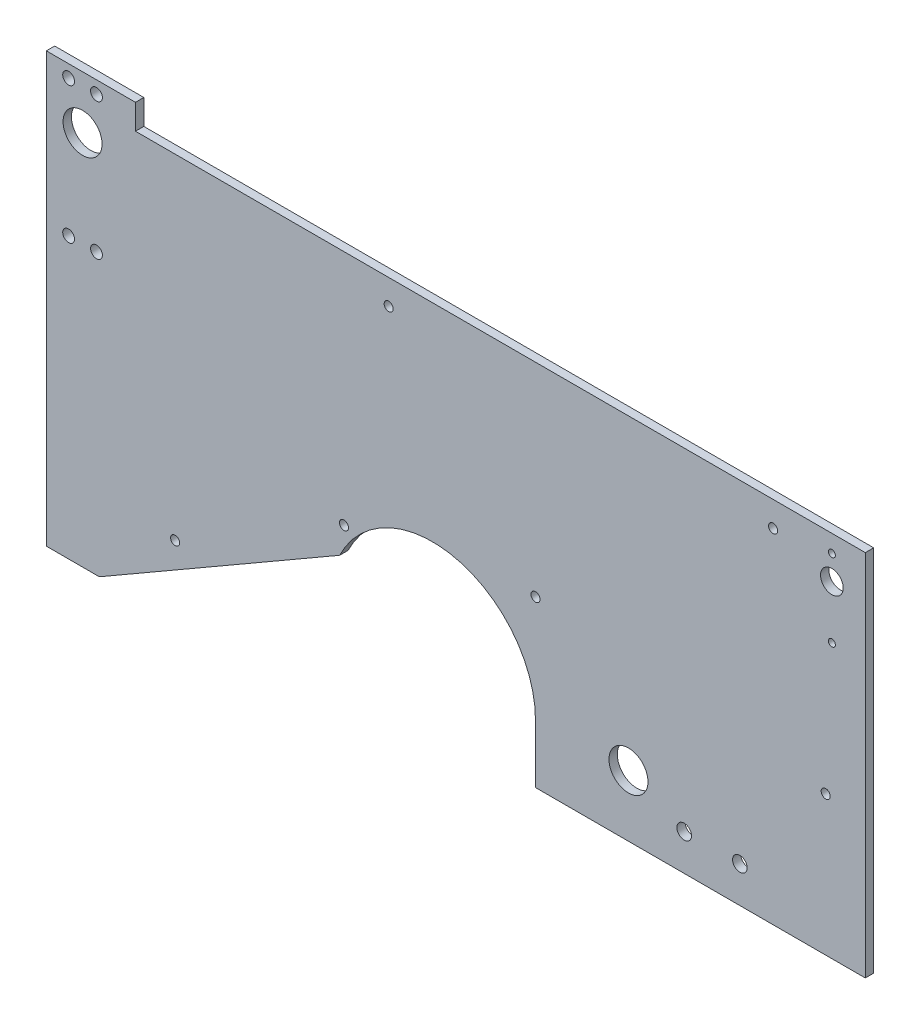
ISO-10303-21;
HEADER;
FILE_DESCRIPTION(('STEP AP214'),'2;1');
FILE_NAME('part.step','',(''),(''),'','','');
FILE_SCHEMA(('AUTOMOTIVE_DESIGN { 1 0 10303 214 1 1 1 1 }'));
ENDSEC;
DATA;
#1=APPLICATION_CONTEXT('core data for automotive mechanical design processes');
#2=APPLICATION_PROTOCOL_DEFINITION('international standard','automotive_design',2000,#1);
#3=PRODUCT_CONTEXT('',#1,'mechanical');
#4=PRODUCT('Part','Part','',(#3));
#5=PRODUCT_RELATED_PRODUCT_CATEGORY('part','',(#4));
#6=PRODUCT_DEFINITION_FORMATION('','',#4);
#7=PRODUCT_DEFINITION_CONTEXT('part definition',#1,'design');
#8=PRODUCT_DEFINITION('design','',#6,#7);
#9=PRODUCT_DEFINITION_SHAPE('','',#8);
#10=(LENGTH_UNIT() NAMED_UNIT(*) SI_UNIT(.MILLI.,.METRE.));
#11=(NAMED_UNIT(*) PLANE_ANGLE_UNIT() SI_UNIT($,.RADIAN.));
#12=(NAMED_UNIT(*) SI_UNIT($,.STERADIAN.) SOLID_ANGLE_UNIT());
#13=UNCERTAINTY_MEASURE_WITH_UNIT(LENGTH_MEASURE(1.E-05),#10,'distance_accuracy_value','');
#14=(GEOMETRIC_REPRESENTATION_CONTEXT(3) GLOBAL_UNCERTAINTY_ASSIGNED_CONTEXT((#13)) GLOBAL_UNIT_ASSIGNED_CONTEXT((#10,
#11,#12)) REPRESENTATION_CONTEXT('',''));
#15=CARTESIAN_POINT('',(0.,0.,0.));
#16=DIRECTION('',(0.,0.,1.));
#17=DIRECTION('',(1.,0.,0.));
#18=AXIS2_PLACEMENT_3D('',#15,#16,#17);
#19=CARTESIAN_POINT('',(144.6,33.7,3.));
#20=DIRECTION('',(0.,0.,1.));
#21=DIRECTION('',(1.,0.,0.));
#22=AXIS2_PLACEMENT_3D('',#19,#20,#21);
#23=PLANE('',#22);
#24=CARTESIAN_POINT('',(112.84,59.93,3.));
#25=DIRECTION('',(0.,0.,1.));
#26=DIRECTION('',(1.,0.,0.));
#27=AXIS2_PLACEMENT_3D('',#24,#25,#26);
#28=CIRCLE('',#27,1.625);
#29=CARTESIAN_POINT('',(114.465,59.93,3.));
#30=VERTEX_POINT('',#29);
#31=EDGE_CURVE('E218',#30,#30,#28,.T.);
#32=ORIENTED_EDGE('',*,*,#31,.F.);
#33=EDGE_LOOP('',(#32));
#34=FACE_BOUND('',#33,.T.);
#35=CARTESIAN_POINT('',(52.23,24.91,3.));
#36=DIRECTION('',(0.,0.,1.));
#37=DIRECTION('',(1.,0.,0.));
#38=AXIS2_PLACEMENT_3D('',#35,#36,#37);
#39=CIRCLE('',#38,1.625);
#40=CARTESIAN_POINT('',(53.855,24.91,3.));
#41=VERTEX_POINT('',#40);
#42=EDGE_CURVE('E240',#41,#41,#39,.T.);
#43=ORIENTED_EDGE('',*,*,#42,.F.);
#44=EDGE_LOOP('',(#43));
#45=FACE_BOUND('',#44,.T.);
#46=CARTESIAN_POINT('',(181.6,72.03,3.));
#47=DIRECTION('',(0.,0.,1.));
#48=DIRECTION('',(1.,0.,0.));
#49=AXIS2_PLACEMENT_3D('',#46,#47,#48);
#50=CIRCLE('',#49,1.62499999999998);
#51=CARTESIAN_POINT('',(183.225,72.03,3.));
#52=VERTEX_POINT('',#51);
#53=EDGE_CURVE('E234',#52,#52,#50,.T.);
#54=ORIENTED_EDGE('',*,*,#53,.F.);
#55=EDGE_LOOP('',(#54));
#56=FACE_BOUND('',#55,.T.);
#57=CARTESIAN_POINT('',(285.78,62.92,3.));
#58=DIRECTION('',(0.,0.,1.));
#59=DIRECTION('',(1.,0.,0.));
#60=AXIS2_PLACEMENT_3D('',#57,#58,#59);
#61=CIRCLE('',#60,1.62499999999998);
#62=CARTESIAN_POINT('',(287.405,62.92,3.));
#63=VERTEX_POINT('',#62);
#64=EDGE_CURVE('E228',#63,#63,#61,.T.);
#65=ORIENTED_EDGE('',*,*,#64,.F.);
#66=EDGE_LOOP('',(#65));
#67=FACE_BOUND('',#66,.T.);
#68=CARTESIAN_POINT('',(234.98,25.75,3.));
#69=DIRECTION('',(0.,0.,1.));
#70=DIRECTION('',(1.,0.,0.));
#71=AXIS2_PLACEMENT_3D('',#68,#69,#70);
#72=CIRCLE('',#71,2.625);
#73=CARTESIAN_POINT('',(237.605,25.75,3.));
#74=VERTEX_POINT('',#73);
#75=EDGE_CURVE('E264',#74,#74,#72,.T.);
#76=ORIENTED_EDGE('',*,*,#75,.F.);
#77=EDGE_LOOP('',(#76));
#78=FACE_BOUND('',#77,.T.);
#79=CARTESIAN_POINT('',(288.,130.,3.));
#80=DIRECTION('',(0.,0.,1.));
#81=DIRECTION('',(1.,0.,0.));
#82=AXIS2_PLACEMENT_3D('',#79,#80,#81);
#83=CIRCLE('',#82,4.07499999999998);
#84=CARTESIAN_POINT('',(292.075,130.,3.));
#85=VERTEX_POINT('',#84);
#86=EDGE_CURVE('E251',#85,#85,#83,.T.);
#87=ORIENTED_EDGE('',*,*,#86,.F.);
#88=EDGE_LOOP('',(#87));
#89=FACE_BOUND('',#88,.T.);
#90=CARTESIAN_POINT('',(288.,138.75,3.));
#91=DIRECTION('',(0.,0.,1.));
#92=DIRECTION('',(1.,0.,0.));
#93=AXIS2_PLACEMENT_3D('',#90,#91,#92);
#94=CIRCLE('',#93,1.24999999999996);
#95=CARTESIAN_POINT('',(289.25,138.75,3.));
#96=VERTEX_POINT('',#95);
#97=EDGE_CURVE('E252',#96,#96,#94,.T.);
#98=ORIENTED_EDGE('',*,*,#97,.F.);
#99=EDGE_LOOP('',(#98));
#100=FACE_BOUND('',#99,.T.);
#101=CARTESIAN_POINT('',(288.,110.95,3.));
#102=DIRECTION('',(0.,0.,1.));
#103=DIRECTION('',(1.,0.,0.));
#104=AXIS2_PLACEMENT_3D('',#101,#102,#103);
#105=CIRCLE('',#104,1.24999999999995);
#106=CARTESIAN_POINT('',(289.25,110.95,3.));
#107=VERTEX_POINT('',#106);
#108=EDGE_CURVE('E227',#107,#107,#105,.T.);
#109=ORIENTED_EDGE('',*,*,#108,.F.);
#110=EDGE_LOOP('',(#109));
#111=FACE_BOUND('',#110,.T.);
#112=CARTESIAN_POINT('',(214.98,34.75,3.));
#113=DIRECTION('',(0.,0.,1.));
#114=DIRECTION('',(1.,0.,0.));
#115=AXIS2_PLACEMENT_3D('',#112,#113,#114);
#116=CIRCLE('',#115,7.00000000000001);
#117=CARTESIAN_POINT('',(221.98,34.75,3.));
#118=VERTEX_POINT('',#117);
#119=EDGE_CURVE('E212',#118,#118,#116,.T.);
#120=ORIENTED_EDGE('',*,*,#119,.F.);
#121=EDGE_LOOP('',(#120));
#122=FACE_BOUND('',#121,.T.);
#123=DIRECTION('',(0.,1.,0.));
#124=VECTOR('',#123,1.);
#125=CARTESIAN_POINT('',(6.,154.,3.));
#126=LINE('',#125,#124);
#127=CARTESIAN_POINT('',(6.00000000000002,0.,3.));
#128=VERTEX_POINT('',#127);
#129=CARTESIAN_POINT('',(6.00000000000002,154.,3.));
#130=VERTEX_POINT('',#129);
#131=EDGE_CURVE('E51',#128,#130,#126,.T.);
#132=ORIENTED_EDGE('',*,*,#131,.F.);
#133=DIRECTION('',(1.,0.,0.));
#134=VECTOR('',#133,1.);
#135=CARTESIAN_POINT('',(0.,0.,3.));
#136=LINE('',#135,#134);
#137=CARTESIAN_POINT('',(25.030359010412,0.,3.));
#138=VERTEX_POINT('',#137);
#139=EDGE_CURVE('E124',#128,#138,#136,.T.);
#140=ORIENTED_EDGE('',*,*,#139,.T.);
#141=DIRECTION('',(0.866025403784438,0.500000000000001,0.));
#142=VECTOR('',#141,1.);
#143=CARTESIAN_POINT('',(25.030359010412,0.,3.));
#144=LINE('',#143,#142);
#145=CARTESIAN_POINT('',(111.286489227342,49.8000000000001,3.));
#146=VERTEX_POINT('',#145);
#147=EDGE_CURVE('E190',#138,#146,#144,.T.);
#148=ORIENTED_EDGE('',*,*,#147,.T.);
#149=CARTESIAN_POINT('',(144.6,33.7,3.));
#150=DIRECTION('',(0.,0.,-1.));
#151=DIRECTION('',(1.,0.,0.));
#152=AXIS2_PLACEMENT_3D('',#149,#150,#151);
#153=CIRCLE('',#152,37.);
#154=CARTESIAN_POINT('',(181.6,33.7,3.));
#155=VERTEX_POINT('',#154);
#156=EDGE_CURVE('E172',#146,#155,#153,.T.);
#157=ORIENTED_EDGE('',*,*,#156,.T.);
#158=DIRECTION('',(0.,-1.,0.));
#159=VECTOR('',#158,1.);
#160=CARTESIAN_POINT('',(181.6,33.7,3.));
#161=LINE('',#160,#159);
#162=CARTESIAN_POINT('',(181.6,12.75,3.));
#163=VERTEX_POINT('',#162);
#164=EDGE_CURVE('E183',#155,#163,#161,.T.);
#165=ORIENTED_EDGE('',*,*,#164,.T.);
#166=DIRECTION('',(-1.,0.,0.));
#167=VECTOR('',#166,1.);
#168=CARTESIAN_POINT('',(181.6,12.75,3.));
#169=LINE('',#168,#167);
#170=CARTESIAN_POINT('',(300.,12.75,3.));
#171=VERTEX_POINT('',#170);
#172=EDGE_CURVE('E275',#171,#163,#169,.T.);
#173=ORIENTED_EDGE('',*,*,#172,.F.);
#174=DIRECTION('',(0.,1.,0.));
#175=VECTOR('',#174,1.);
#176=CARTESIAN_POINT('',(300.,0.,3.));
#177=LINE('',#176,#175);
#178=CARTESIAN_POINT('',(300.,145.,3.));
#179=VERTEX_POINT('',#178);
#180=EDGE_CURVE('E186',#171,#179,#177,.T.);
#181=ORIENTED_EDGE('',*,*,#180,.T.);
#182=DIRECTION('',(-1.,0.,0.));
#183=VECTOR('',#182,1.);
#184=CARTESIAN_POINT('',(38.,145.,3.));
#185=LINE('',#184,#183);
#186=CARTESIAN_POINT('',(38.,145.,3.));
#187=VERTEX_POINT('',#186);
#188=EDGE_CURVE('E188',#179,#187,#185,.T.);
#189=ORIENTED_EDGE('',*,*,#188,.T.);
#190=DIRECTION('',(0.,1.,0.));
#191=VECTOR('',#190,1.);
#192=CARTESIAN_POINT('',(38.,154.,3.));
#193=LINE('',#192,#191);
#194=CARTESIAN_POINT('',(38.,154.,3.));
#195=VERTEX_POINT('',#194);
#196=EDGE_CURVE('E194',#187,#195,#193,.T.);
#197=ORIENTED_EDGE('',*,*,#196,.T.);
#198=DIRECTION('',(-1.,0.,0.));
#199=VECTOR('',#198,1.);
#200=CARTESIAN_POINT('',(19.,154.,3.));
#201=LINE('',#200,#199);
#202=EDGE_CURVE('E139',#195,#130,#201,.T.);
#203=ORIENTED_EDGE('',*,*,#202,.T.);
#204=EDGE_LOOP('',(#132,#140,#148,#157,#165,#173,#181,#189,#197,#203));
#205=FACE_BOUND('',#204,.T.);
#206=CARTESIAN_POINT('',(128.895,135.995,3.));
#207=DIRECTION('',(0.,0.,1.));
#208=DIRECTION('',(1.,0.,0.));
#209=AXIS2_PLACEMENT_3D('',#206,#207,#208);
#210=CIRCLE('',#209,1.62499999999998);
#211=CARTESIAN_POINT('',(130.52,135.995,3.));
#212=VERTEX_POINT('',#211);
#213=EDGE_CURVE('E202',#212,#212,#210,.T.);
#214=ORIENTED_EDGE('',*,*,#213,.F.);
#215=EDGE_LOOP('',(#214));
#216=FACE_BOUND('',#215,.T.);
#217=CARTESIAN_POINT('',(266.895,135.995,3.));
#218=DIRECTION('',(0.,0.,1.));
#219=DIRECTION('',(1.,0.,0.));
#220=AXIS2_PLACEMENT_3D('',#217,#218,#219);
#221=CIRCLE('',#220,1.62499999999998);
#222=CARTESIAN_POINT('',(268.52,135.995,3.));
#223=VERTEX_POINT('',#222);
#224=EDGE_CURVE('E219',#223,#223,#221,.T.);
#225=ORIENTED_EDGE('',*,*,#224,.F.);
#226=EDGE_LOOP('',(#225));
#227=FACE_BOUND('',#226,.T.);
#228=CARTESIAN_POINT('',(254.98,25.75,3.));
#229=DIRECTION('',(0.,0.,1.));
#230=DIRECTION('',(1.,0.,0.));
#231=AXIS2_PLACEMENT_3D('',#228,#229,#230);
#232=CIRCLE('',#231,2.62499999999997);
#233=CARTESIAN_POINT('',(257.605,25.75,3.));
#234=VERTEX_POINT('',#233);
#235=EDGE_CURVE('E263',#234,#234,#232,.T.);
#236=ORIENTED_EDGE('',*,*,#235,.F.);
#237=EDGE_LOOP('',(#236));
#238=FACE_BOUND('',#237,.T.);
#239=CARTESIAN_POINT('',(24.,149.5,3.));
#240=DIRECTION('',(0.,0.,1.));
#241=DIRECTION('',(-1.,0.,0.));
#242=AXIS2_PLACEMENT_3D('',#239,#240,#241);
#243=CIRCLE('',#242,2.125);
#244=CARTESIAN_POINT('',(21.875,149.5,3.));
#245=VERTEX_POINT('',#244);
#246=EDGE_CURVE('E290',#245,#245,#243,.T.);
#247=ORIENTED_EDGE('',*,*,#246,.F.);
#248=EDGE_LOOP('',(#247));
#249=FACE_BOUND('',#248,.T.);
#250=CARTESIAN_POINT('',(24.,100.5,3.));
#251=DIRECTION('',(0.,0.,1.));
#252=DIRECTION('',(1.,0.,0.));
#253=AXIS2_PLACEMENT_3D('',#250,#251,#252);
#254=CIRCLE('',#253,2.125);
#255=CARTESIAN_POINT('',(26.125,100.5,3.));
#256=VERTEX_POINT('',#255);
#257=EDGE_CURVE('E302',#256,#256,#254,.T.);
#258=ORIENTED_EDGE('',*,*,#257,.F.);
#259=EDGE_LOOP('',(#258));
#260=FACE_BOUND('',#259,.T.);
#261=CARTESIAN_POINT('',(19.,135.,3.));
#262=DIRECTION('',(0.,0.,1.));
#263=DIRECTION('',(1.,0.,0.));
#264=AXIS2_PLACEMENT_3D('',#261,#262,#263);
#265=CIRCLE('',#264,7.);
#266=CARTESIAN_POINT('',(26.,135.,3.));
#267=VERTEX_POINT('',#266);
#268=EDGE_CURVE('E131',#267,#267,#265,.T.);
#269=ORIENTED_EDGE('',*,*,#268,.F.);
#270=EDGE_LOOP('',(#269));
#271=FACE_BOUND('',#270,.T.);
#272=CARTESIAN_POINT('',(14.,149.5,3.));
#273=DIRECTION('',(0.,0.,1.));
#274=DIRECTION('',(1.,0.,0.));
#275=AXIS2_PLACEMENT_3D('',#272,#273,#274);
#276=CIRCLE('',#275,2.125);
#277=CARTESIAN_POINT('',(16.125,149.5,3.));
#278=VERTEX_POINT('',#277);
#279=EDGE_CURVE('E296',#278,#278,#276,.T.);
#280=ORIENTED_EDGE('',*,*,#279,.F.);
#281=EDGE_LOOP('',(#280));
#282=FACE_BOUND('',#281,.T.);
#283=CARTESIAN_POINT('',(14.,100.5,3.));
#284=DIRECTION('',(0.,0.,1.));
#285=DIRECTION('',(1.,0.,0.));
#286=AXIS2_PLACEMENT_3D('',#283,#284,#285);
#287=CIRCLE('',#286,2.125);
#288=CARTESIAN_POINT('',(16.125,100.5,3.));
#289=VERTEX_POINT('',#288);
#290=EDGE_CURVE('E284',#289,#289,#287,.T.);
#291=ORIENTED_EDGE('',*,*,#290,.F.);
#292=EDGE_LOOP('',(#291));
#293=FACE_BOUND('',#292,.T.);
#294=ADVANCED_FACE('F36',(#34,#45,#56,#67,#78,#89,#100,#111,#122,#205,#216,#227,#238,#249,#260,
#271,#282,#293),#23,.T.);
#295=CARTESIAN_POINT('',(144.6,33.7,0.));
#296=DIRECTION('',(0.,0.,1.));
#297=DIRECTION('',(1.,0.,0.));
#298=AXIS2_PLACEMENT_3D('',#295,#296,#297);
#299=PLANE('',#298);
#300=CARTESIAN_POINT('',(112.84,59.93,0.));
#301=DIRECTION('',(0.,0.,1.));
#302=DIRECTION('',(1.,0.,0.));
#303=AXIS2_PLACEMENT_3D('',#300,#301,#302);
#304=CIRCLE('',#303,1.625);
#305=CARTESIAN_POINT('',(114.465,59.93,0.));
#306=VERTEX_POINT('',#305);
#307=EDGE_CURVE('E243',#306,#306,#304,.T.);
#308=ORIENTED_EDGE('',*,*,#307,.T.);
#309=EDGE_LOOP('',(#308));
#310=FACE_BOUND('',#309,.T.);
#311=CARTESIAN_POINT('',(52.23,24.91,0.));
#312=DIRECTION('',(0.,0.,1.));
#313=DIRECTION('',(1.,0.,0.));
#314=AXIS2_PLACEMENT_3D('',#311,#312,#313);
#315=CIRCLE('',#314,1.625);
#316=CARTESIAN_POINT('',(53.855,24.91,0.));
#317=VERTEX_POINT('',#316);
#318=EDGE_CURVE('E237',#317,#317,#315,.T.);
#319=ORIENTED_EDGE('',*,*,#318,.T.);
#320=EDGE_LOOP('',(#319));
#321=FACE_BOUND('',#320,.T.);
#322=CARTESIAN_POINT('',(181.6,72.03,0.));
#323=DIRECTION('',(0.,0.,1.));
#324=DIRECTION('',(1.,0.,0.));
#325=AXIS2_PLACEMENT_3D('',#322,#323,#324);
#326=CIRCLE('',#325,1.62499999999998);
#327=CARTESIAN_POINT('',(183.225,72.03,0.));
#328=VERTEX_POINT('',#327);
#329=EDGE_CURVE('E231',#328,#328,#326,.T.);
#330=ORIENTED_EDGE('',*,*,#329,.T.);
#331=EDGE_LOOP('',(#330));
#332=FACE_BOUND('',#331,.T.);
#333=CARTESIAN_POINT('',(285.78,62.92,0.));
#334=DIRECTION('',(0.,0.,1.));
#335=DIRECTION('',(1.,0.,0.));
#336=AXIS2_PLACEMENT_3D('',#333,#334,#335);
#337=CIRCLE('',#336,1.62499999999998);
#338=CARTESIAN_POINT('',(287.405,62.92,0.));
#339=VERTEX_POINT('',#338);
#340=EDGE_CURVE('E224',#339,#339,#337,.T.);
#341=ORIENTED_EDGE('',*,*,#340,.T.);
#342=EDGE_LOOP('',(#341));
#343=FACE_BOUND('',#342,.T.);
#344=CARTESIAN_POINT('',(234.98,25.75,0.));
#345=DIRECTION('',(0.,0.,1.));
#346=DIRECTION('',(1.,0.,0.));
#347=AXIS2_PLACEMENT_3D('',#344,#345,#346);
#348=CIRCLE('',#347,2.625);
#349=CARTESIAN_POINT('',(237.605,25.75,0.));
#350=VERTEX_POINT('',#349);
#351=EDGE_CURVE('E260',#350,#350,#348,.T.);
#352=ORIENTED_EDGE('',*,*,#351,.T.);
#353=EDGE_LOOP('',(#352));
#354=FACE_BOUND('',#353,.T.);
#355=CARTESIAN_POINT('',(288.,130.,0.));
#356=DIRECTION('',(0.,0.,1.));
#357=DIRECTION('',(1.,0.,0.));
#358=AXIS2_PLACEMENT_3D('',#355,#356,#357);
#359=CIRCLE('',#358,4.07499999999998);
#360=CARTESIAN_POINT('',(292.075,130.,0.));
#361=VERTEX_POINT('',#360);
#362=EDGE_CURVE('E267',#361,#361,#359,.T.);
#363=ORIENTED_EDGE('',*,*,#362,.T.);
#364=EDGE_LOOP('',(#363));
#365=FACE_BOUND('',#364,.T.);
#366=CARTESIAN_POINT('',(288.,138.75,0.));
#367=DIRECTION('',(0.,0.,1.));
#368=DIRECTION('',(1.,0.,0.));
#369=AXIS2_PLACEMENT_3D('',#366,#367,#368);
#370=CIRCLE('',#369,1.24999999999996);
#371=CARTESIAN_POINT('',(289.25,138.75,0.));
#372=VERTEX_POINT('',#371);
#373=EDGE_CURVE('E248',#372,#372,#370,.T.);
#374=ORIENTED_EDGE('',*,*,#373,.T.);
#375=EDGE_LOOP('',(#374));
#376=FACE_BOUND('',#375,.T.);
#377=CARTESIAN_POINT('',(288.,110.95,0.));
#378=DIRECTION('',(0.,0.,1.));
#379=DIRECTION('',(1.,0.,0.));
#380=AXIS2_PLACEMENT_3D('',#377,#378,#379);
#381=CIRCLE('',#380,1.24999999999995);
#382=CARTESIAN_POINT('',(289.25,110.95,0.));
#383=VERTEX_POINT('',#382);
#384=EDGE_CURVE('E255',#383,#383,#381,.T.);
#385=ORIENTED_EDGE('',*,*,#384,.T.);
#386=EDGE_LOOP('',(#385));
#387=FACE_BOUND('',#386,.T.);
#388=CARTESIAN_POINT('',(214.98,34.75,0.));
#389=DIRECTION('',(0.,0.,1.));
#390=DIRECTION('',(1.,0.,0.));
#391=AXIS2_PLACEMENT_3D('',#388,#389,#390);
#392=CIRCLE('',#391,7.00000000000001);
#393=CARTESIAN_POINT('',(221.98,34.75,0.));
#394=VERTEX_POINT('',#393);
#395=EDGE_CURVE('E209',#394,#394,#392,.T.);
#396=ORIENTED_EDGE('',*,*,#395,.T.);
#397=EDGE_LOOP('',(#396));
#398=FACE_BOUND('',#397,.T.);
#399=CARTESIAN_POINT('',(128.895,135.995,0.));
#400=DIRECTION('',(0.,0.,1.));
#401=DIRECTION('',(1.,0.,0.));
#402=AXIS2_PLACEMENT_3D('',#399,#400,#401);
#403=CIRCLE('',#402,1.62499999999998);
#404=CARTESIAN_POINT('',(130.52,135.995,0.));
#405=VERTEX_POINT('',#404);
#406=EDGE_CURVE('E205',#405,#405,#403,.T.);
#407=ORIENTED_EDGE('',*,*,#406,.T.);
#408=EDGE_LOOP('',(#407));
#409=FACE_BOUND('',#408,.T.);
#410=CARTESIAN_POINT('',(266.895,135.995,0.));
#411=DIRECTION('',(0.,0.,1.));
#412=DIRECTION('',(1.,0.,0.));
#413=AXIS2_PLACEMENT_3D('',#410,#411,#412);
#414=CIRCLE('',#413,1.62499999999998);
#415=CARTESIAN_POINT('',(268.52,135.995,0.));
#416=VERTEX_POINT('',#415);
#417=EDGE_CURVE('E215',#416,#416,#414,.T.);
#418=ORIENTED_EDGE('',*,*,#417,.T.);
#419=EDGE_LOOP('',(#418));
#420=FACE_BOUND('',#419,.T.);
#421=CARTESIAN_POINT('',(254.98,25.75,0.));
#422=DIRECTION('',(0.,0.,1.));
#423=DIRECTION('',(1.,0.,0.));
#424=AXIS2_PLACEMENT_3D('',#421,#422,#423);
#425=CIRCLE('',#424,2.62499999999997);
#426=CARTESIAN_POINT('',(257.605,25.75,0.));
#427=VERTEX_POINT('',#426);
#428=EDGE_CURVE('E272',#427,#427,#425,.T.);
#429=ORIENTED_EDGE('',*,*,#428,.T.);
#430=EDGE_LOOP('',(#429));
#431=FACE_BOUND('',#430,.T.);
#432=DIRECTION('',(1.,0.,0.));
#433=VECTOR('',#432,1.);
#434=CARTESIAN_POINT('',(0.,0.,0.));
#435=LINE('',#434,#433);
#436=CARTESIAN_POINT('',(6.00000000000002,0.,0.));
#437=VERTEX_POINT('',#436);
#438=CARTESIAN_POINT('',(25.030359010412,0.,0.));
#439=VERTEX_POINT('',#438);
#440=EDGE_CURVE('E123',#437,#439,#435,.T.);
#441=ORIENTED_EDGE('',*,*,#440,.F.);
#442=DIRECTION('',(0.,1.,0.));
#443=VECTOR('',#442,1.);
#444=CARTESIAN_POINT('',(6.,154.,0.));
#445=LINE('',#444,#443);
#446=CARTESIAN_POINT('',(6.,154.,0.));
#447=VERTEX_POINT('',#446);
#448=EDGE_CURVE('E111',#437,#447,#445,.T.);
#449=ORIENTED_EDGE('',*,*,#448,.T.);
#450=DIRECTION('',(-1.,0.,0.));
#451=VECTOR('',#450,1.);
#452=CARTESIAN_POINT('',(0.,154.,0.));
#453=LINE('',#452,#451);
#454=CARTESIAN_POINT('',(38.,154.,0.));
#455=VERTEX_POINT('',#454);
#456=EDGE_CURVE('E153',#455,#447,#453,.T.);
#457=ORIENTED_EDGE('',*,*,#456,.F.);
#458=DIRECTION('',(0.,1.,0.));
#459=VECTOR('',#458,1.);
#460=CARTESIAN_POINT('',(38.,154.,0.));
#461=LINE('',#460,#459);
#462=CARTESIAN_POINT('',(38.,145.,0.));
#463=VERTEX_POINT('',#462);
#464=EDGE_CURVE('E150',#463,#455,#461,.T.);
#465=ORIENTED_EDGE('',*,*,#464,.F.);
#466=DIRECTION('',(-1.,0.,0.));
#467=VECTOR('',#466,1.);
#468=CARTESIAN_POINT('',(38.,145.,0.));
#469=LINE('',#468,#467);
#470=CARTESIAN_POINT('',(300.,145.,0.));
#471=VERTEX_POINT('',#470);
#472=EDGE_CURVE('E148',#471,#463,#469,.T.);
#473=ORIENTED_EDGE('',*,*,#472,.F.);
#474=DIRECTION('',(0.,1.,0.));
#475=VECTOR('',#474,1.);
#476=CARTESIAN_POINT('',(300.,0.,0.));
#477=LINE('',#476,#475);
#478=CARTESIAN_POINT('',(300.,12.75,0.));
#479=VERTEX_POINT('',#478);
#480=EDGE_CURVE('E146',#479,#471,#477,.T.);
#481=ORIENTED_EDGE('',*,*,#480,.F.);
#482=DIRECTION('',(-1.,0.,0.));
#483=VECTOR('',#482,1.);
#484=CARTESIAN_POINT('',(181.6,12.75,0.));
#485=LINE('',#484,#483);
#486=CARTESIAN_POINT('',(181.6,12.75,0.));
#487=VERTEX_POINT('',#486);
#488=EDGE_CURVE('E59',#479,#487,#485,.T.);
#489=ORIENTED_EDGE('',*,*,#488,.T.);
#490=DIRECTION('',(0.,-1.,0.));
#491=VECTOR('',#490,1.);
#492=CARTESIAN_POINT('',(181.6,33.7,0.));
#493=LINE('',#492,#491);
#494=CARTESIAN_POINT('',(181.6,33.7,0.));
#495=VERTEX_POINT('',#494);
#496=EDGE_CURVE('E143',#495,#487,#493,.T.);
#497=ORIENTED_EDGE('',*,*,#496,.F.);
#498=CARTESIAN_POINT('',(144.6,33.7,0.));
#499=DIRECTION('',(0.,0.,-1.));
#500=DIRECTION('',(1.,0.,0.));
#501=AXIS2_PLACEMENT_3D('',#498,#499,#500);
#502=CIRCLE('',#501,37.);
#503=CARTESIAN_POINT('',(111.286489227342,49.8000000000001,0.));
#504=VERTEX_POINT('',#503);
#505=EDGE_CURVE('E133',#504,#495,#502,.T.);
#506=ORIENTED_EDGE('',*,*,#505,.F.);
#507=DIRECTION('',(0.866025403784438,0.500000000000001,0.));
#508=VECTOR('',#507,1.);
#509=CARTESIAN_POINT('',(25.030359010412,0.,0.));
#510=LINE('',#509,#508);
#511=EDGE_CURVE('E130',#439,#504,#510,.T.);
#512=ORIENTED_EDGE('',*,*,#511,.F.);
#513=EDGE_LOOP('',(#441,#449,#457,#465,#473,#481,#489,#497,#506,#512));
#514=FACE_BOUND('',#513,.T.);
#515=CARTESIAN_POINT('',(19.,135.,0.));
#516=DIRECTION('',(0.,0.,1.));
#517=DIRECTION('',(1.,0.,0.));
#518=AXIS2_PLACEMENT_3D('',#515,#516,#517);
#519=CIRCLE('',#518,7.);
#520=CARTESIAN_POINT('',(26.,135.,0.));
#521=VERTEX_POINT('',#520);
#522=EDGE_CURVE('E136',#521,#521,#519,.T.);
#523=ORIENTED_EDGE('',*,*,#522,.T.);
#524=EDGE_LOOP('',(#523));
#525=FACE_BOUND('',#524,.T.);
#526=CARTESIAN_POINT('',(24.,100.5,0.));
#527=DIRECTION('',(0.,0.,1.));
#528=DIRECTION('',(1.,0.,0.));
#529=AXIS2_PLACEMENT_3D('',#526,#527,#528);
#530=CIRCLE('',#529,2.125);
#531=CARTESIAN_POINT('',(26.125,100.5,0.));
#532=VERTEX_POINT('',#531);
#533=EDGE_CURVE('E299',#532,#532,#530,.T.);
#534=ORIENTED_EDGE('',*,*,#533,.T.);
#535=EDGE_LOOP('',(#534));
#536=FACE_BOUND('',#535,.T.);
#537=CARTESIAN_POINT('',(14.,149.5,0.));
#538=DIRECTION('',(0.,0.,1.));
#539=DIRECTION('',(1.,0.,0.));
#540=AXIS2_PLACEMENT_3D('',#537,#538,#539);
#541=CIRCLE('',#540,2.125);
#542=CARTESIAN_POINT('',(16.125,149.5,0.));
#543=VERTEX_POINT('',#542);
#544=EDGE_CURVE('E293',#543,#543,#541,.T.);
#545=ORIENTED_EDGE('',*,*,#544,.T.);
#546=EDGE_LOOP('',(#545));
#547=FACE_BOUND('',#546,.T.);
#548=CARTESIAN_POINT('',(24.,149.5,0.));
#549=DIRECTION('',(0.,0.,1.));
#550=DIRECTION('',(-1.,0.,0.));
#551=AXIS2_PLACEMENT_3D('',#548,#549,#550);
#552=CIRCLE('',#551,2.125);
#553=CARTESIAN_POINT('',(21.875,149.5,0.));
#554=VERTEX_POINT('',#553);
#555=EDGE_CURVE('E287',#554,#554,#552,.T.);
#556=ORIENTED_EDGE('',*,*,#555,.T.);
#557=EDGE_LOOP('',(#556));
#558=FACE_BOUND('',#557,.T.);
#559=CARTESIAN_POINT('',(14.,100.5,0.));
#560=DIRECTION('',(0.,0.,1.));
#561=DIRECTION('',(1.,0.,0.));
#562=AXIS2_PLACEMENT_3D('',#559,#560,#561);
#563=CIRCLE('',#562,2.125);
#564=CARTESIAN_POINT('',(16.125,100.5,0.));
#565=VERTEX_POINT('',#564);
#566=EDGE_CURVE('E282',#565,#565,#563,.T.);
#567=ORIENTED_EDGE('',*,*,#566,.T.);
#568=EDGE_LOOP('',(#567));
#569=FACE_BOUND('',#568,.T.);
#570=ADVANCED_FACE('F127',(#310,#321,#332,#343,#354,#365,#376,#387,#398,#409,#420,#431,#514,
#525,#536,#547,#558,#569),#299,.F.);
#571=CARTESIAN_POINT('',(0.,0.,3.));
#572=DIRECTION('',(0.,1.,0.));
#573=DIRECTION('',(0.,0.,1.));
#574=AXIS2_PLACEMENT_3D('',#571,#572,#573);
#575=PLANE('',#574);
#576=ORIENTED_EDGE('',*,*,#139,.F.);
#577=DIRECTION('',(0.,0.,1.));
#578=VECTOR('',#577,1.);
#579=CARTESIAN_POINT('',(6.00000000000002,0.,0.));
#580=LINE('',#579,#578);
#581=EDGE_CURVE('E114',#437,#128,#580,.T.);
#582=ORIENTED_EDGE('',*,*,#581,.F.);
#583=ORIENTED_EDGE('',*,*,#440,.T.);
#584=DIRECTION('',(0.,0.,-1.));
#585=VECTOR('',#584,1.);
#586=CARTESIAN_POINT('',(25.030359010412,0.,3.));
#587=LINE('',#586,#585);
#588=EDGE_CURVE('E11',#138,#439,#587,.T.);
#589=ORIENTED_EDGE('',*,*,#588,.F.);
#590=EDGE_LOOP('',(#576,#582,#583,#589));
#591=FACE_BOUND('',#590,.T.);
#592=ADVANCED_FACE('F38',(#591),#575,.F.);
#593=CARTESIAN_POINT('',(25.030359010412,0.,3.));
#594=DIRECTION('',(-0.500000000000001,0.866025403784438,0.));
#595=DIRECTION('',(-0.866025403784438,-0.500000000000001,0.));
#596=AXIS2_PLACEMENT_3D('',#593,#594,#595);
#597=PLANE('',#596);
#598=ORIENTED_EDGE('',*,*,#511,.T.);
#599=DIRECTION('',(0.,0.,-1.));
#600=VECTOR('',#599,1.);
#601=CARTESIAN_POINT('',(111.286489227342,49.8000000000001,3.));
#602=LINE('',#601,#600);
#603=EDGE_CURVE('E44',#146,#504,#602,.T.);
#604=ORIENTED_EDGE('',*,*,#603,.F.);
#605=ORIENTED_EDGE('',*,*,#147,.F.);
#606=ORIENTED_EDGE('',*,*,#588,.T.);
#607=EDGE_LOOP('',(#598,#604,#605,#606));
#608=FACE_BOUND('',#607,.T.);
#609=ADVANCED_FACE('F309',(#608),#597,.F.);
#610=CARTESIAN_POINT('',(144.6,33.7,3.));
#611=DIRECTION('',(0.,0.,-1.));
#612=DIRECTION('',(-1.,0.,0.));
#613=AXIS2_PLACEMENT_3D('',#610,#611,#612);
#614=CYLINDRICAL_SURFACE('',#613,37.);
#615=ORIENTED_EDGE('',*,*,#505,.T.);
#616=DIRECTION('',(0.,0.,-1.));
#617=VECTOR('',#616,1.);
#618=CARTESIAN_POINT('',(181.6,33.7,3.));
#619=LINE('',#618,#617);
#620=EDGE_CURVE('E164',#155,#495,#619,.T.);
#621=ORIENTED_EDGE('',*,*,#620,.F.);
#622=ORIENTED_EDGE('',*,*,#156,.F.);
#623=ORIENTED_EDGE('',*,*,#603,.T.);
#624=EDGE_LOOP('',(#615,#621,#622,#623));
#625=FACE_BOUND('',#624,.T.);
#626=ADVANCED_FACE('F170',(#625),#614,.F.);
#627=CARTESIAN_POINT('',(181.6,33.7,3.));
#628=DIRECTION('',(1.,0.,0.));
#629=DIRECTION('',(0.,0.,-1.));
#630=AXIS2_PLACEMENT_3D('',#627,#628,#629);
#631=PLANE('',#630);
#632=ORIENTED_EDGE('',*,*,#496,.T.);
#633=DIRECTION('',(0.,0.,1.));
#634=VECTOR('',#633,1.);
#635=CARTESIAN_POINT('',(181.6,12.75,0.));
#636=LINE('',#635,#634);
#637=EDGE_CURVE('E181',#487,#163,#636,.T.);
#638=ORIENTED_EDGE('',*,*,#637,.T.);
#639=ORIENTED_EDGE('',*,*,#164,.F.);
#640=ORIENTED_EDGE('',*,*,#620,.T.);
#641=EDGE_LOOP('',(#632,#638,#639,#640));
#642=FACE_BOUND('',#641,.T.);
#643=ADVANCED_FACE('F179',(#642),#631,.F.);
#644=CARTESIAN_POINT('',(300.,0.,3.));
#645=DIRECTION('',(-1.,0.,0.));
#646=DIRECTION('',(0.,0.,1.));
#647=AXIS2_PLACEMENT_3D('',#644,#645,#646);
#648=PLANE('',#647);
#649=ORIENTED_EDGE('',*,*,#180,.F.);
#650=DIRECTION('',(0.,0.,1.));
#651=VECTOR('',#650,1.);
#652=CARTESIAN_POINT('',(300.,12.75,0.));
#653=LINE('',#652,#651);
#654=EDGE_CURVE('E279',#479,#171,#653,.T.);
#655=ORIENTED_EDGE('',*,*,#654,.F.);
#656=ORIENTED_EDGE('',*,*,#480,.T.);
#657=DIRECTION('',(0.,0.,-1.));
#658=VECTOR('',#657,1.);
#659=CARTESIAN_POINT('',(300.,145.,3.));
#660=LINE('',#659,#658);
#661=EDGE_CURVE('E161',#179,#471,#660,.T.);
#662=ORIENTED_EDGE('',*,*,#661,.F.);
#663=EDGE_LOOP('',(#649,#655,#656,#662));
#664=FACE_BOUND('',#663,.T.);
#665=ADVANCED_FACE('F339',(#664),#648,.F.);
#666=CARTESIAN_POINT('',(38.,145.,3.));
#667=DIRECTION('',(0.,-1.,0.));
#668=DIRECTION('',(0.,0.,-1.));
#669=AXIS2_PLACEMENT_3D('',#666,#667,#668);
#670=PLANE('',#669);
#671=ORIENTED_EDGE('',*,*,#472,.T.);
#672=DIRECTION('',(0.,0.,-1.));
#673=VECTOR('',#672,1.);
#674=CARTESIAN_POINT('',(38.,145.,3.));
#675=LINE('',#674,#673);
#676=EDGE_CURVE('E158',#187,#463,#675,.T.);
#677=ORIENTED_EDGE('',*,*,#676,.F.);
#678=ORIENTED_EDGE('',*,*,#188,.F.);
#679=ORIENTED_EDGE('',*,*,#661,.T.);
#680=EDGE_LOOP('',(#671,#677,#678,#679));
#681=FACE_BOUND('',#680,.T.);
#682=ADVANCED_FACE('F335',(#681),#670,.F.);
#683=CARTESIAN_POINT('',(38.,154.,3.));
#684=DIRECTION('',(-1.,0.,0.));
#685=DIRECTION('',(0.,0.,1.));
#686=AXIS2_PLACEMENT_3D('',#683,#684,#685);
#687=PLANE('',#686);
#688=ORIENTED_EDGE('',*,*,#464,.T.);
#689=DIRECTION('',(0.,0.,-1.));
#690=VECTOR('',#689,1.);
#691=CARTESIAN_POINT('',(38.,154.,3.));
#692=LINE('',#691,#690);
#693=EDGE_CURVE('E155',#195,#455,#692,.T.);
#694=ORIENTED_EDGE('',*,*,#693,.F.);
#695=ORIENTED_EDGE('',*,*,#196,.F.);
#696=ORIENTED_EDGE('',*,*,#676,.T.);
#697=EDGE_LOOP('',(#688,#694,#695,#696));
#698=FACE_BOUND('',#697,.T.);
#699=ADVANCED_FACE('F332',(#698),#687,.F.);
#700=CARTESIAN_POINT('',(0.,154.,3.));
#701=DIRECTION('',(0.,-1.,0.));
#702=DIRECTION('',(0.,0.,-1.));
#703=AXIS2_PLACEMENT_3D('',#700,#701,#702);
#704=PLANE('',#703);
#705=ORIENTED_EDGE('',*,*,#456,.T.);
#706=DIRECTION('',(0.,0.,1.));
#707=VECTOR('',#706,1.);
#708=CARTESIAN_POINT('',(6.,154.,0.));
#709=LINE('',#708,#707);
#710=EDGE_CURVE('E115',#447,#130,#709,.T.);
#711=ORIENTED_EDGE('',*,*,#710,.T.);
#712=ORIENTED_EDGE('',*,*,#202,.F.);
#713=ORIENTED_EDGE('',*,*,#693,.T.);
#714=EDGE_LOOP('',(#705,#711,#712,#713));
#715=FACE_BOUND('',#714,.T.);
#716=ADVANCED_FACE('F201',(#715),#704,.F.);
#717=CARTESIAN_POINT('',(19.,135.,3.));
#718=DIRECTION('',(0.,0.,-1.));
#719=DIRECTION('',(-1.,0.,0.));
#720=AXIS2_PLACEMENT_3D('',#717,#718,#719);
#721=CYLINDRICAL_SURFACE('',#720,7.);
#722=ORIENTED_EDGE('',*,*,#268,.T.);
#723=EDGE_LOOP('',(#722));
#724=FACE_BOUND('',#723,.T.);
#725=ORIENTED_EDGE('',*,*,#522,.F.);
#726=EDGE_LOOP('',(#725));
#727=FACE_BOUND('',#726,.T.);
#728=ADVANCED_FACE('F327',(#724,#727),#721,.F.);
#729=CARTESIAN_POINT('',(24.,100.5,3.));
#730=DIRECTION('',(0.,0.,-1.));
#731=DIRECTION('',(-1.,0.,0.));
#732=AXIS2_PLACEMENT_3D('',#729,#730,#731);
#733=CYLINDRICAL_SURFACE('',#732,2.125);
#734=ORIENTED_EDGE('',*,*,#257,.T.);
#735=EDGE_LOOP('',(#734));
#736=FACE_BOUND('',#735,.T.);
#737=ORIENTED_EDGE('',*,*,#533,.F.);
#738=EDGE_LOOP('',(#737));
#739=FACE_BOUND('',#738,.T.);
#740=ADVANCED_FACE('F374',(#736,#739),#733,.F.);
#741=CARTESIAN_POINT('',(14.,149.5,3.));
#742=DIRECTION('',(0.,0.,-1.));
#743=DIRECTION('',(-1.,0.,0.));
#744=AXIS2_PLACEMENT_3D('',#741,#742,#743);
#745=CYLINDRICAL_SURFACE('',#744,2.125);
#746=ORIENTED_EDGE('',*,*,#279,.T.);
#747=EDGE_LOOP('',(#746));
#748=FACE_BOUND('',#747,.T.);
#749=ORIENTED_EDGE('',*,*,#544,.F.);
#750=EDGE_LOOP('',(#749));
#751=FACE_BOUND('',#750,.T.);
#752=ADVANCED_FACE('F381',(#748,#751),#745,.F.);
#753=CARTESIAN_POINT('',(24.,149.5,3.));
#754=DIRECTION('',(0.,0.,-1.));
#755=DIRECTION('',(-1.,0.,0.));
#756=AXIS2_PLACEMENT_3D('',#753,#754,#755);
#757=CYLINDRICAL_SURFACE('',#756,2.125);
#758=ORIENTED_EDGE('',*,*,#246,.T.);
#759=EDGE_LOOP('',(#758));
#760=FACE_BOUND('',#759,.T.);
#761=ORIENTED_EDGE('',*,*,#555,.F.);
#762=EDGE_LOOP('',(#761));
#763=FACE_BOUND('',#762,.T.);
#764=ADVANCED_FACE('F388',(#760,#763),#757,.F.);
#765=CARTESIAN_POINT('',(14.,100.5,3.));
#766=DIRECTION('',(0.,0.,-1.));
#767=DIRECTION('',(-1.,0.,0.));
#768=AXIS2_PLACEMENT_3D('',#765,#766,#767);
#769=CYLINDRICAL_SURFACE('',#768,2.125);
#770=ORIENTED_EDGE('',*,*,#290,.T.);
#771=EDGE_LOOP('',(#770));
#772=FACE_BOUND('',#771,.T.);
#773=ORIENTED_EDGE('',*,*,#566,.F.);
#774=EDGE_LOOP('',(#773));
#775=FACE_BOUND('',#774,.T.);
#776=ADVANCED_FACE('F396',(#772,#775),#769,.F.);
#777=CARTESIAN_POINT('',(181.6,12.75,0.));
#778=DIRECTION('',(0.,1.,0.));
#779=DIRECTION('',(0.,0.,1.));
#780=AXIS2_PLACEMENT_3D('',#777,#778,#779);
#781=PLANE('',#780);
#782=ORIENTED_EDGE('',*,*,#172,.T.);
#783=ORIENTED_EDGE('',*,*,#637,.F.);
#784=ORIENTED_EDGE('',*,*,#488,.F.);
#785=ORIENTED_EDGE('',*,*,#654,.T.);
#786=EDGE_LOOP('',(#782,#783,#784,#785));
#787=FACE_BOUND('',#786,.T.);
#788=ADVANCED_FACE('F403',(#787),#781,.F.);
#789=CARTESIAN_POINT('',(6.,154.,0.));
#790=DIRECTION('',(1.,0.,0.));
#791=DIRECTION('',(0.,1.,0.));
#792=AXIS2_PLACEMENT_3D('',#789,#790,#791);
#793=PLANE('',#792);
#794=ORIENTED_EDGE('',*,*,#131,.T.);
#795=ORIENTED_EDGE('',*,*,#710,.F.);
#796=ORIENTED_EDGE('',*,*,#448,.F.);
#797=ORIENTED_EDGE('',*,*,#581,.T.);
#798=EDGE_LOOP('',(#794,#795,#796,#797));
#799=FACE_BOUND('',#798,.T.);
#800=ADVANCED_FACE('F113',(#799),#793,.F.);
#801=CARTESIAN_POINT('',(254.98,25.75,0.));
#802=DIRECTION('',(0.,0.,1.));
#803=DIRECTION('',(1.,0.,0.));
#804=AXIS2_PLACEMENT_3D('',#801,#802,#803);
#805=CYLINDRICAL_SURFACE('',#804,2.62499999999997);
#806=ORIENTED_EDGE('',*,*,#428,.F.);
#807=EDGE_LOOP('',(#806));
#808=FACE_BOUND('',#807,.T.);
#809=ORIENTED_EDGE('',*,*,#235,.T.);
#810=EDGE_LOOP('',(#809));
#811=FACE_BOUND('',#810,.T.);
#812=ADVANCED_FACE('F416',(#808,#811),#805,.F.);
#813=CARTESIAN_POINT('',(266.895,135.995,0.));
#814=DIRECTION('',(0.,0.,1.));
#815=DIRECTION('',(1.,0.,0.));
#816=AXIS2_PLACEMENT_3D('',#813,#814,#815);
#817=CYLINDRICAL_SURFACE('',#816,1.62499999999998);
#818=ORIENTED_EDGE('',*,*,#417,.F.);
#819=EDGE_LOOP('',(#818));
#820=FACE_BOUND('',#819,.T.);
#821=ORIENTED_EDGE('',*,*,#224,.T.);
#822=EDGE_LOOP('',(#821));
#823=FACE_BOUND('',#822,.T.);
#824=ADVANCED_FACE('F424',(#820,#823),#817,.F.);
#825=CARTESIAN_POINT('',(128.895,135.995,0.));
#826=DIRECTION('',(0.,0.,1.));
#827=DIRECTION('',(1.,0.,0.));
#828=AXIS2_PLACEMENT_3D('',#825,#826,#827);
#829=CYLINDRICAL_SURFACE('',#828,1.62499999999998);
#830=ORIENTED_EDGE('',*,*,#406,.F.);
#831=EDGE_LOOP('',(#830));
#832=FACE_BOUND('',#831,.T.);
#833=ORIENTED_EDGE('',*,*,#213,.T.);
#834=EDGE_LOOP('',(#833));
#835=FACE_BOUND('',#834,.T.);
#836=ADVANCED_FACE('F432',(#832,#835),#829,.F.);
#837=CARTESIAN_POINT('',(214.98,34.75,0.));
#838=DIRECTION('',(0.,0.,1.));
#839=DIRECTION('',(1.,0.,0.));
#840=AXIS2_PLACEMENT_3D('',#837,#838,#839);
#841=CYLINDRICAL_SURFACE('',#840,7.00000000000001);
#842=ORIENTED_EDGE('',*,*,#395,.F.);
#843=EDGE_LOOP('',(#842));
#844=FACE_BOUND('',#843,.T.);
#845=ORIENTED_EDGE('',*,*,#119,.T.);
#846=EDGE_LOOP('',(#845));
#847=FACE_BOUND('',#846,.T.);
#848=ADVANCED_FACE('F440',(#844,#847),#841,.F.);
#849=CARTESIAN_POINT('',(288.,110.95,0.));
#850=DIRECTION('',(0.,0.,1.));
#851=DIRECTION('',(1.,0.,0.));
#852=AXIS2_PLACEMENT_3D('',#849,#850,#851);
#853=CYLINDRICAL_SURFACE('',#852,1.24999999999995);
#854=ORIENTED_EDGE('',*,*,#384,.F.);
#855=EDGE_LOOP('',(#854));
#856=FACE_BOUND('',#855,.T.);
#857=ORIENTED_EDGE('',*,*,#108,.T.);
#858=EDGE_LOOP('',(#857));
#859=FACE_BOUND('',#858,.T.);
#860=ADVANCED_FACE('F448',(#856,#859),#853,.F.);
#861=CARTESIAN_POINT('',(288.,138.75,0.));
#862=DIRECTION('',(0.,0.,1.));
#863=DIRECTION('',(1.,0.,0.));
#864=AXIS2_PLACEMENT_3D('',#861,#862,#863);
#865=CYLINDRICAL_SURFACE('',#864,1.24999999999996);
#866=ORIENTED_EDGE('',*,*,#373,.F.);
#867=EDGE_LOOP('',(#866));
#868=FACE_BOUND('',#867,.T.);
#869=ORIENTED_EDGE('',*,*,#97,.T.);
#870=EDGE_LOOP('',(#869));
#871=FACE_BOUND('',#870,.T.);
#872=ADVANCED_FACE('F456',(#868,#871),#865,.F.);
#873=CARTESIAN_POINT('',(288.,130.,0.));
#874=DIRECTION('',(0.,0.,1.));
#875=DIRECTION('',(1.,0.,0.));
#876=AXIS2_PLACEMENT_3D('',#873,#874,#875);
#877=CYLINDRICAL_SURFACE('',#876,4.07499999999998);
#878=ORIENTED_EDGE('',*,*,#362,.F.);
#879=EDGE_LOOP('',(#878));
#880=FACE_BOUND('',#879,.T.);
#881=ORIENTED_EDGE('',*,*,#86,.T.);
#882=EDGE_LOOP('',(#881));
#883=FACE_BOUND('',#882,.T.);
#884=ADVANCED_FACE('F464',(#880,#883),#877,.F.);
#885=CARTESIAN_POINT('',(234.98,25.75,0.));
#886=DIRECTION('',(0.,0.,1.));
#887=DIRECTION('',(1.,0.,0.));
#888=AXIS2_PLACEMENT_3D('',#885,#886,#887);
#889=CYLINDRICAL_SURFACE('',#888,2.625);
#890=ORIENTED_EDGE('',*,*,#351,.F.);
#891=EDGE_LOOP('',(#890));
#892=FACE_BOUND('',#891,.T.);
#893=ORIENTED_EDGE('',*,*,#75,.T.);
#894=EDGE_LOOP('',(#893));
#895=FACE_BOUND('',#894,.T.);
#896=ADVANCED_FACE('F472',(#892,#895),#889,.F.);
#897=CARTESIAN_POINT('',(285.78,62.92,0.));
#898=DIRECTION('',(0.,0.,1.));
#899=DIRECTION('',(1.,0.,0.));
#900=AXIS2_PLACEMENT_3D('',#897,#898,#899);
#901=CYLINDRICAL_SURFACE('',#900,1.62499999999998);
#902=ORIENTED_EDGE('',*,*,#340,.F.);
#903=EDGE_LOOP('',(#902));
#904=FACE_BOUND('',#903,.T.);
#905=ORIENTED_EDGE('',*,*,#64,.T.);
#906=EDGE_LOOP('',(#905));
#907=FACE_BOUND('',#906,.T.);
#908=ADVANCED_FACE('F480',(#904,#907),#901,.F.);
#909=CARTESIAN_POINT('',(181.6,72.03,0.));
#910=DIRECTION('',(0.,0.,1.));
#911=DIRECTION('',(1.,0.,0.));
#912=AXIS2_PLACEMENT_3D('',#909,#910,#911);
#913=CYLINDRICAL_SURFACE('',#912,1.62499999999998);
#914=ORIENTED_EDGE('',*,*,#329,.F.);
#915=EDGE_LOOP('',(#914));
#916=FACE_BOUND('',#915,.T.);
#917=ORIENTED_EDGE('',*,*,#53,.T.);
#918=EDGE_LOOP('',(#917));
#919=FACE_BOUND('',#918,.T.);
#920=ADVANCED_FACE('F488',(#916,#919),#913,.F.);
#921=CARTESIAN_POINT('',(52.23,24.91,0.));
#922=DIRECTION('',(0.,0.,1.));
#923=DIRECTION('',(1.,0.,0.));
#924=AXIS2_PLACEMENT_3D('',#921,#922,#923);
#925=CYLINDRICAL_SURFACE('',#924,1.625);
#926=ORIENTED_EDGE('',*,*,#318,.F.);
#927=EDGE_LOOP('',(#926));
#928=FACE_BOUND('',#927,.T.);
#929=ORIENTED_EDGE('',*,*,#42,.T.);
#930=EDGE_LOOP('',(#929));
#931=FACE_BOUND('',#930,.T.);
#932=ADVANCED_FACE('F496',(#928,#931),#925,.F.);
#933=CARTESIAN_POINT('',(112.84,59.93,0.));
#934=DIRECTION('',(0.,0.,1.));
#935=DIRECTION('',(1.,0.,0.));
#936=AXIS2_PLACEMENT_3D('',#933,#934,#935);
#937=CYLINDRICAL_SURFACE('',#936,1.625);
#938=ORIENTED_EDGE('',*,*,#307,.F.);
#939=EDGE_LOOP('',(#938));
#940=FACE_BOUND('',#939,.T.);
#941=ORIENTED_EDGE('',*,*,#31,.T.);
#942=EDGE_LOOP('',(#941));
#943=FACE_BOUND('',#942,.T.);
#944=ADVANCED_FACE('F504',(#940,#943),#937,.F.);
#945=CLOSED_SHELL('',(#294,#570,#592,#609,#626,#643,#665,#682,#699,#716,#728,#740,#752,#764,
#776,#788,#800,#812,#824,#836,#848,#860,#872,#884,#896,#908,#920,#932,#944));
#946=MANIFOLD_SOLID_BREP('B2',#945);
#947=ADVANCED_BREP_SHAPE_REPRESENTATION('',(#18,#946),#14);
#948=SHAPE_DEFINITION_REPRESENTATION(#9,#947);
ENDSEC;
END-ISO-10303-21;
